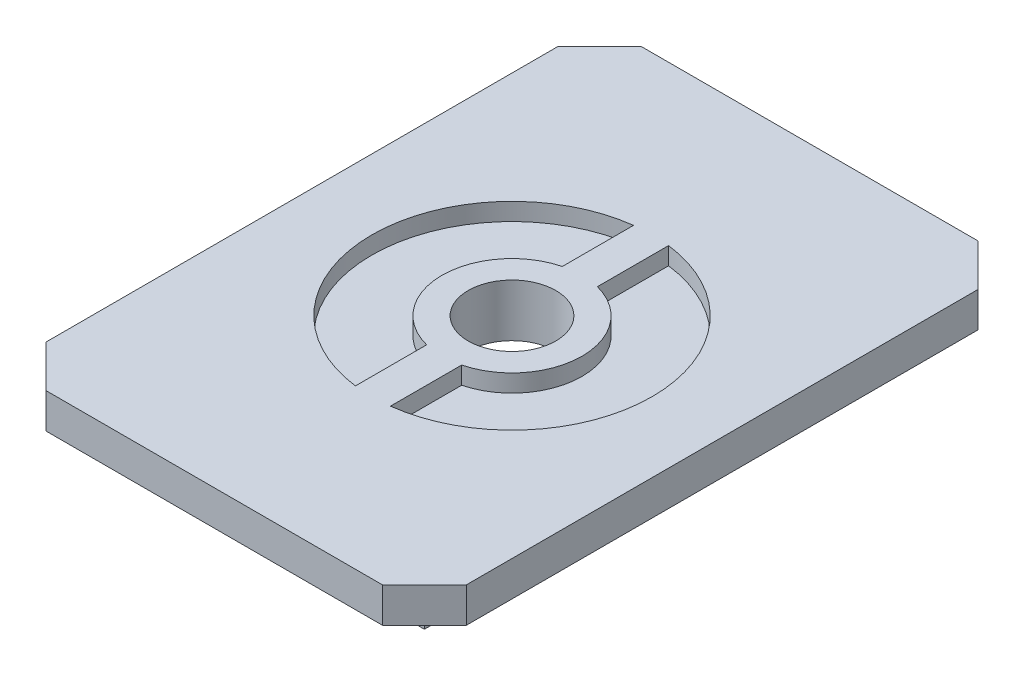
ISO-10303-21;
HEADER;
FILE_DESCRIPTION(('STEP AP214'),'2;1');
FILE_NAME('part.step','',(''),(''),'','','');
FILE_SCHEMA(('AUTOMOTIVE_DESIGN { 1 0 10303 214 1 1 1 1 }'));
ENDSEC;
DATA;
#1=APPLICATION_CONTEXT('core data for automotive mechanical design processes');
#2=APPLICATION_PROTOCOL_DEFINITION('international standard','automotive_design',2000,#1);
#3=PRODUCT_CONTEXT('',#1,'mechanical');
#4=PRODUCT('Part','Part','',(#3));
#5=PRODUCT_RELATED_PRODUCT_CATEGORY('part','',(#4));
#6=PRODUCT_DEFINITION_FORMATION('','',#4);
#7=PRODUCT_DEFINITION_CONTEXT('part definition',#1,'design');
#8=PRODUCT_DEFINITION('design','',#6,#7);
#9=PRODUCT_DEFINITION_SHAPE('','',#8);
#10=(LENGTH_UNIT() NAMED_UNIT(*) SI_UNIT(.MILLI.,.METRE.));
#11=(NAMED_UNIT(*) PLANE_ANGLE_UNIT() SI_UNIT($,.RADIAN.));
#12=(NAMED_UNIT(*) SI_UNIT($,.STERADIAN.) SOLID_ANGLE_UNIT());
#13=UNCERTAINTY_MEASURE_WITH_UNIT(LENGTH_MEASURE(1.E-05),#10,'distance_accuracy_value','');
#14=(GEOMETRIC_REPRESENTATION_CONTEXT(3) GLOBAL_UNCERTAINTY_ASSIGNED_CONTEXT((#13)) GLOBAL_UNIT_ASSIGNED_CONTEXT((#10,
#11,#12)) REPRESENTATION_CONTEXT('',''));
#15=CARTESIAN_POINT('',(0.,0.,0.));
#16=DIRECTION('',(0.,0.,1.));
#17=DIRECTION('',(1.,0.,0.));
#18=AXIS2_PLACEMENT_3D('',#15,#16,#17);
#19=CARTESIAN_POINT('',(-92.1670163689328,3.175,83.0436849533953));
#20=DIRECTION('',(0.,1.,0.));
#21=DIRECTION('',(0.,0.,1.));
#22=AXIS2_PLACEMENT_3D('',#19,#20,#21);
#23=PLANE('',#22);
#24=CARTESIAN_POINT('',(-73.1170163689327,3.175,56.0561849533953));
#25=DIRECTION('',(0.,1.,0.));
#26=DIRECTION('',(0.,0.,1.));
#27=AXIS2_PLACEMENT_3D('',#24,#25,#26);
#28=CIRCLE('',#27,3.96875000000001);
#29=CARTESIAN_POINT('',(-73.1170163689327,3.175,60.0249349533953));
#30=VERTEX_POINT('',#29);
#31=EDGE_CURVE('E225',#30,#30,#28,.T.);
#32=ORIENTED_EDGE('',*,*,#31,.F.);
#33=EDGE_LOOP('',(#32));
#34=FACE_BOUND('',#33,.T.);
#35=DIRECTION('',(0.,0.,1.));
#36=VECTOR('',#35,1.);
#37=CARTESIAN_POINT('',(-71.5295163689327,3.175,56.0561849533953));
#38=LINE('',#37,#36);
#39=CARTESIAN_POINT('',(-71.5295163689327,3.175,62.2045460154996));
#40=VERTEX_POINT('',#39);
#41=CARTESIAN_POINT('',(-71.5295163689327,3.175,68.6565755723404));
#42=VERTEX_POINT('',#41);
#43=EDGE_CURVE('E255',#40,#42,#38,.T.);
#44=ORIENTED_EDGE('',*,*,#43,.F.);
#45=CARTESIAN_POINT('',(-73.1170163689327,3.175,56.0561849533953));
#46=DIRECTION('',(0.,1.,0.));
#47=DIRECTION('',(0.,0.,1.));
#48=AXIS2_PLACEMENT_3D('',#45,#46,#47);
#49=CIRCLE('',#48,6.35);
#50=CARTESIAN_POINT('',(-71.5295163689327,3.175,49.9078238912911));
#51=VERTEX_POINT('',#50);
#52=EDGE_CURVE('E86',#40,#51,#49,.T.);
#53=ORIENTED_EDGE('',*,*,#52,.T.);
#54=DIRECTION('',(0.,0.,1.));
#55=VECTOR('',#54,1.);
#56=CARTESIAN_POINT('',(-71.5295163689327,3.175,56.0561849533953));
#57=LINE('',#56,#55);
#58=CARTESIAN_POINT('',(-71.5295163689327,3.175,43.4557943344502));
#59=VERTEX_POINT('',#58);
#60=EDGE_CURVE('E244',#59,#51,#57,.T.);
#61=ORIENTED_EDGE('',*,*,#60,.F.);
#62=CARTESIAN_POINT('',(-73.1170163689327,3.175,56.0561849533953));
#63=DIRECTION('',(0.,1.,0.));
#64=DIRECTION('',(0.,0.,1.));
#65=AXIS2_PLACEMENT_3D('',#62,#63,#64);
#66=CIRCLE('',#65,12.7);
#67=EDGE_CURVE('E258',#42,#59,#66,.T.);
#68=ORIENTED_EDGE('',*,*,#67,.F.);
#69=EDGE_LOOP('',(#44,#53,#61,#68));
#70=FACE_BOUND('',#69,.T.);
#71=DIRECTION('',(-1.,0.,0.));
#72=VECTOR('',#71,1.);
#73=CARTESIAN_POINT('',(-92.1670163689327,3.175,29.0686849533953));
#74=LINE('',#73,#72);
#75=CARTESIAN_POINT('',(-57.8770163689328,3.175,29.0686849533953));
#76=VERTEX_POINT('',#75);
#77=CARTESIAN_POINT('',(-88.3570163689327,3.175,29.0686849533953));
#78=VERTEX_POINT('',#77);
#79=EDGE_CURVE('E314',#76,#78,#74,.T.);
#80=ORIENTED_EDGE('',*,*,#79,.T.);
#81=DIRECTION('',(0.707106781186549,0.,-0.707106781186546));
#82=VECTOR('',#81,1.);
#83=CARTESIAN_POINT('',(-117.249516368933,3.175,57.9611849533952));
#84=LINE('',#83,#82);
#85=CARTESIAN_POINT('',(-92.1670163689327,3.175,32.8786849533953));
#86=VERTEX_POINT('',#85);
#87=EDGE_CURVE('E351',#78,#86,#84,.F.);
#88=ORIENTED_EDGE('',*,*,#87,.T.);
#89=DIRECTION('',(0.,0.,1.));
#90=VECTOR('',#89,1.);
#91=CARTESIAN_POINT('',(-92.1670163689327,3.175,29.0686849533953));
#92=LINE('',#91,#90);
#93=CARTESIAN_POINT('',(-92.1670163689328,3.175,79.2336849533953));
#94=VERTEX_POINT('',#93);
#95=EDGE_CURVE('E304',#86,#94,#92,.T.);
#96=ORIENTED_EDGE('',*,*,#95,.T.);
#97=DIRECTION('',(-0.707106781186546,0.,-0.707106781186549));
#98=VECTOR('',#97,1.);
#99=CARTESIAN_POINT('',(-90.2620163689328,3.175,81.1386849533953));
#100=LINE('',#99,#98);
#101=CARTESIAN_POINT('',(-88.3570163689328,3.175,83.0436849533953));
#102=VERTEX_POINT('',#101);
#103=EDGE_CURVE('E345',#94,#102,#100,.F.);
#104=ORIENTED_EDGE('',*,*,#103,.T.);
#105=DIRECTION('',(1.,0.,0.));
#106=VECTOR('',#105,1.);
#107=CARTESIAN_POINT('',(-92.1670163689328,3.175,83.0436849533953));
#108=LINE('',#107,#106);
#109=CARTESIAN_POINT('',(-57.8770163689328,3.175,83.0436849533953));
#110=VERTEX_POINT('',#109);
#111=EDGE_CURVE('E307',#102,#110,#108,.T.);
#112=ORIENTED_EDGE('',*,*,#111,.T.);
#113=DIRECTION('',(-0.707106781186549,0.,0.707106781186546));
#114=VECTOR('',#113,1.);
#115=CARTESIAN_POINT('',(-75.0220163689328,3.175,100.188684953395));
#116=LINE('',#115,#114);
#117=CARTESIAN_POINT('',(-54.0670163689328,3.175,79.2336849533953));
#118=VERTEX_POINT('',#117);
#119=EDGE_CURVE('E347',#110,#118,#116,.F.);
#120=ORIENTED_EDGE('',*,*,#119,.T.);
#121=DIRECTION('',(0.,0.,-1.));
#122=VECTOR('',#121,1.);
#123=CARTESIAN_POINT('',(-54.0670163689328,3.175,29.0686849533953));
#124=LINE('',#123,#122);
#125=CARTESIAN_POINT('',(-54.0670163689328,3.175,32.8786849533953));
#126=VERTEX_POINT('',#125);
#127=EDGE_CURVE('E311',#118,#126,#124,.T.);
#128=ORIENTED_EDGE('',*,*,#127,.T.);
#129=DIRECTION('',(0.707106781186546,0.,0.70710678118655));
#130=VECTOR('',#129,1.);
#131=CARTESIAN_POINT('',(-48.0345163689327,3.175,38.9111849533955));
#132=LINE('',#131,#130);
#133=EDGE_CURVE('E349',#126,#76,#132,.F.);
#134=ORIENTED_EDGE('',*,*,#133,.T.);
#135=EDGE_LOOP('',(#80,#88,#96,#104,#112,#120,#128,#134));
#136=FACE_BOUND('',#135,.T.);
#137=DIRECTION('',(0.,0.,1.));
#138=VECTOR('',#137,1.);
#139=CARTESIAN_POINT('',(-74.7045163689328,3.175,56.0561849533953));
#140=LINE('',#139,#138);
#141=CARTESIAN_POINT('',(-74.7045163689328,3.175,43.4557943344502));
#142=VERTEX_POINT('',#141);
#143=CARTESIAN_POINT('',(-74.7045163689328,3.175,49.9078238912911));
#144=VERTEX_POINT('',#143);
#145=EDGE_CURVE('E231',#142,#144,#140,.T.);
#146=ORIENTED_EDGE('',*,*,#145,.T.);
#147=CARTESIAN_POINT('',(-73.1170163689327,3.175,56.0561849533953));
#148=DIRECTION('',(0.,1.,0.));
#149=DIRECTION('',(0.,0.,1.));
#150=AXIS2_PLACEMENT_3D('',#147,#148,#149);
#151=CIRCLE('',#150,6.35);
#152=CARTESIAN_POINT('',(-74.7045163689328,3.175,62.2045460154996));
#153=VERTEX_POINT('',#152);
#154=EDGE_CURVE('E78',#144,#153,#151,.T.);
#155=ORIENTED_EDGE('',*,*,#154,.T.);
#156=DIRECTION('',(0.,0.,1.));
#157=VECTOR('',#156,1.);
#158=CARTESIAN_POINT('',(-74.7045163689328,3.175,56.0561849533953));
#159=LINE('',#158,#157);
#160=CARTESIAN_POINT('',(-74.7045163689328,3.175,68.6565755723404));
#161=VERTEX_POINT('',#160);
#162=EDGE_CURVE('E219',#153,#161,#159,.T.);
#163=ORIENTED_EDGE('',*,*,#162,.T.);
#164=CARTESIAN_POINT('',(-73.1170163689327,3.175,56.0561849533953));
#165=DIRECTION('',(0.,1.,0.));
#166=DIRECTION('',(0.,0.,1.));
#167=AXIS2_PLACEMENT_3D('',#164,#165,#166);
#168=CIRCLE('',#167,12.7);
#169=EDGE_CURVE('E222',#142,#161,#168,.T.);
#170=ORIENTED_EDGE('',*,*,#169,.F.);
#171=EDGE_LOOP('',(#146,#155,#163,#170));
#172=FACE_BOUND('',#171,.T.);
#173=ADVANCED_FACE('F63',(#34,#70,#136,#172),#23,.T.);
#174=CARTESIAN_POINT('',(-92.1670163689328,0.,83.0436849533953));
#175=DIRECTION('',(0.,1.,0.));
#176=DIRECTION('',(0.,0.,1.));
#177=AXIS2_PLACEMENT_3D('',#174,#175,#176);
#178=PLANE('',#177);
#179=DIRECTION('',(0.,0.,1.));
#180=VECTOR('',#179,1.);
#181=CARTESIAN_POINT('',(-92.1670163689327,0.,29.0686849533953));
#182=LINE('',#181,#180);
#183=CARTESIAN_POINT('',(-92.1670163689327,0.,32.8786849533953));
#184=VERTEX_POINT('',#183);
#185=CARTESIAN_POINT('',(-92.1670163689328,0.,79.2336849533953));
#186=VERTEX_POINT('',#185);
#187=EDGE_CURVE('E303',#184,#186,#182,.T.);
#188=ORIENTED_EDGE('',*,*,#187,.F.);
#189=DIRECTION('',(-0.707106781186549,0.,0.707106781186546));
#190=VECTOR('',#189,1.);
#191=CARTESIAN_POINT('',(-92.1670163689327,0.,32.8786849533953));
#192=LINE('',#191,#190);
#193=CARTESIAN_POINT('',(-88.3570163689327,0.,29.0686849533953));
#194=VERTEX_POINT('',#193);
#195=EDGE_CURVE('E338',#184,#194,#192,.F.);
#196=ORIENTED_EDGE('',*,*,#195,.T.);
#197=DIRECTION('',(-1.,0.,0.));
#198=VECTOR('',#197,1.);
#199=CARTESIAN_POINT('',(-92.1670163689327,0.,29.0686849533953));
#200=LINE('',#199,#198);
#201=CARTESIAN_POINT('',(-57.8770163689328,0.,29.0686849533953));
#202=VERTEX_POINT('',#201);
#203=EDGE_CURVE('E308',#202,#194,#200,.T.);
#204=ORIENTED_EDGE('',*,*,#203,.F.);
#205=DIRECTION('',(-0.707106781186546,0.,-0.70710678118655));
#206=VECTOR('',#205,1.);
#207=CARTESIAN_POINT('',(-57.8770163689328,0.,29.0686849533953));
#208=LINE('',#207,#206);
#209=CARTESIAN_POINT('',(-54.0670163689328,0.,32.8786849533954));
#210=VERTEX_POINT('',#209);
#211=EDGE_CURVE('E336',#202,#210,#208,.F.);
#212=ORIENTED_EDGE('',*,*,#211,.T.);
#213=DIRECTION('',(0.,0.,-1.));
#214=VECTOR('',#213,1.);
#215=CARTESIAN_POINT('',(-54.0670163689328,0.,29.0686849533953));
#216=LINE('',#215,#214);
#217=CARTESIAN_POINT('',(-54.0670163689328,0.,79.2336849533953));
#218=VERTEX_POINT('',#217);
#219=EDGE_CURVE('E323',#218,#210,#216,.T.);
#220=ORIENTED_EDGE('',*,*,#219,.F.);
#221=DIRECTION('',(0.707106781186549,0.,-0.707106781186546));
#222=VECTOR('',#221,1.);
#223=CARTESIAN_POINT('',(-54.0670163689328,0.,79.2336849533953));
#224=LINE('',#223,#222);
#225=CARTESIAN_POINT('',(-57.8770163689328,0.,83.0436849533953));
#226=VERTEX_POINT('',#225);
#227=EDGE_CURVE('E334',#218,#226,#224,.F.);
#228=ORIENTED_EDGE('',*,*,#227,.T.);
#229=DIRECTION('',(1.,0.,0.));
#230=VECTOR('',#229,1.);
#231=CARTESIAN_POINT('',(-92.1670163689328,0.,83.0436849533953));
#232=LINE('',#231,#230);
#233=CARTESIAN_POINT('',(-88.3570163689328,0.,83.0436849533953));
#234=VERTEX_POINT('',#233);
#235=EDGE_CURVE('E320',#234,#226,#232,.T.);
#236=ORIENTED_EDGE('',*,*,#235,.F.);
#237=DIRECTION('',(0.707106781186546,0.,0.707106781186549));
#238=VECTOR('',#237,1.);
#239=CARTESIAN_POINT('',(-88.3570163689328,0.,83.0436849533953));
#240=LINE('',#239,#238);
#241=EDGE_CURVE('E332',#234,#186,#240,.F.);
#242=ORIENTED_EDGE('',*,*,#241,.T.);
#243=EDGE_LOOP('',(#188,#196,#204,#212,#220,#228,#236,#242));
#244=FACE_BOUND('',#243,.T.);
#245=DIRECTION('',(0.,0.,-1.));
#246=VECTOR('',#245,1.);
#247=CARTESIAN_POINT('',(-88.9920163689328,0.,79.8686849533953));
#248=LINE('',#247,#246);
#249=CARTESIAN_POINT('',(-88.9920163689328,0.,79.8686849533953));
#250=VERTEX_POINT('',#249);
#251=CARTESIAN_POINT('',(-88.9920163689328,0.,32.2436849533953));
#252=VERTEX_POINT('',#251);
#253=EDGE_CURVE('E265',#250,#252,#248,.T.);
#254=ORIENTED_EDGE('',*,*,#253,.F.);
#255=DIRECTION('',(-1.,0.,0.));
#256=VECTOR('',#255,1.);
#257=CARTESIAN_POINT('',(-88.9920163689328,0.,79.8686849533953));
#258=LINE('',#257,#256);
#259=CARTESIAN_POINT('',(-57.2420163689328,0.,79.8686849533953));
#260=VERTEX_POINT('',#259);
#261=EDGE_CURVE('E275',#260,#250,#258,.T.);
#262=ORIENTED_EDGE('',*,*,#261,.F.);
#263=DIRECTION('',(0.,0.,1.));
#264=VECTOR('',#263,1.);
#265=CARTESIAN_POINT('',(-57.2420163689328,0.,79.8686849533953));
#266=LINE('',#265,#264);
#267=CARTESIAN_POINT('',(-57.2420163689327,0.,32.2436849533953));
#268=VERTEX_POINT('',#267);
#269=EDGE_CURVE('E287',#268,#260,#266,.T.);
#270=ORIENTED_EDGE('',*,*,#269,.F.);
#271=DIRECTION('',(1.,0.,0.));
#272=VECTOR('',#271,1.);
#273=CARTESIAN_POINT('',(-88.9920163689328,0.,32.2436849533953));
#274=LINE('',#273,#272);
#275=EDGE_CURVE('E284',#252,#268,#274,.T.);
#276=ORIENTED_EDGE('',*,*,#275,.F.);
#277=EDGE_LOOP('',(#254,#262,#270,#276));
#278=FACE_BOUND('',#277,.T.);
#279=ADVANCED_FACE('F368',(#244,#278),#178,.F.);
#280=CARTESIAN_POINT('',(-92.1670163689327,3.175,29.0686849533953));
#281=DIRECTION('',(1.,0.,0.));
#282=DIRECTION('',(0.,0.,-1.));
#283=AXIS2_PLACEMENT_3D('',#280,#281,#282);
#284=PLANE('',#283);
#285=ORIENTED_EDGE('',*,*,#95,.F.);
#286=DIRECTION('',(0.,-1.,0.));
#287=VECTOR('',#286,1.);
#288=CARTESIAN_POINT('',(-92.1670163689327,3.175,32.8786849533953));
#289=LINE('',#288,#287);
#290=EDGE_CURVE('E329',#86,#184,#289,.T.);
#291=ORIENTED_EDGE('',*,*,#290,.T.);
#292=ORIENTED_EDGE('',*,*,#187,.T.);
#293=DIRECTION('',(0.,1.,0.));
#294=VECTOR('',#293,1.);
#295=CARTESIAN_POINT('',(-92.1670163689328,3.175,79.2336849533953));
#296=LINE('',#295,#294);
#297=EDGE_CURVE('E317',#186,#94,#296,.T.);
#298=ORIENTED_EDGE('',*,*,#297,.T.);
#299=EDGE_LOOP('',(#285,#291,#292,#298));
#300=FACE_BOUND('',#299,.T.);
#301=ADVANCED_FACE('F396',(#300),#284,.F.);
#302=CARTESIAN_POINT('',(-92.1670163689328,3.175,83.0436849533953));
#303=DIRECTION('',(0.,0.,-1.));
#304=DIRECTION('',(-1.,0.,0.));
#305=AXIS2_PLACEMENT_3D('',#302,#303,#304);
#306=PLANE('',#305);
#307=ORIENTED_EDGE('',*,*,#235,.T.);
#308=DIRECTION('',(0.,1.,0.));
#309=VECTOR('',#308,1.);
#310=CARTESIAN_POINT('',(-57.8770163689328,3.175,83.0436849533953));
#311=LINE('',#310,#309);
#312=EDGE_CURVE('E12',#226,#110,#311,.T.);
#313=ORIENTED_EDGE('',*,*,#312,.T.);
#314=ORIENTED_EDGE('',*,*,#111,.F.);
#315=DIRECTION('',(0.,-1.,0.));
#316=VECTOR('',#315,1.);
#317=CARTESIAN_POINT('',(-88.3570163689328,3.175,83.0436849533953));
#318=LINE('',#317,#316);
#319=EDGE_CURVE('E71',#102,#234,#318,.T.);
#320=ORIENTED_EDGE('',*,*,#319,.T.);
#321=EDGE_LOOP('',(#307,#313,#314,#320));
#322=FACE_BOUND('',#321,.T.);
#323=ADVANCED_FACE('F362',(#322),#306,.F.);
#324=CARTESIAN_POINT('',(-54.0670163689328,3.175,29.0686849533953));
#325=DIRECTION('',(-1.,0.,0.));
#326=DIRECTION('',(0.,0.,1.));
#327=AXIS2_PLACEMENT_3D('',#324,#325,#326);
#328=PLANE('',#327);
#329=ORIENTED_EDGE('',*,*,#219,.T.);
#330=DIRECTION('',(0.,1.,0.));
#331=VECTOR('',#330,1.);
#332=CARTESIAN_POINT('',(-54.0670163689328,3.175,32.8786849533954));
#333=LINE('',#332,#331);
#334=EDGE_CURVE('E356',#210,#126,#333,.T.);
#335=ORIENTED_EDGE('',*,*,#334,.T.);
#336=ORIENTED_EDGE('',*,*,#127,.F.);
#337=DIRECTION('',(0.,-1.,0.));
#338=VECTOR('',#337,1.);
#339=CARTESIAN_POINT('',(-54.0670163689328,3.175,79.2336849533953));
#340=LINE('',#339,#338);
#341=EDGE_CURVE('E353',#118,#218,#340,.T.);
#342=ORIENTED_EDGE('',*,*,#341,.T.);
#343=EDGE_LOOP('',(#329,#335,#336,#342));
#344=FACE_BOUND('',#343,.T.);
#345=ADVANCED_FACE('F377',(#344),#328,.F.);
#346=CARTESIAN_POINT('',(-92.1670163689327,3.175,29.0686849533953));
#347=DIRECTION('',(0.,0.,1.));
#348=DIRECTION('',(1.,0.,0.));
#349=AXIS2_PLACEMENT_3D('',#346,#347,#348);
#350=PLANE('',#349);
#351=ORIENTED_EDGE('',*,*,#203,.T.);
#352=DIRECTION('',(0.,1.,0.));
#353=VECTOR('',#352,1.);
#354=CARTESIAN_POINT('',(-88.3570163689327,3.175,29.0686849533953));
#355=LINE('',#354,#353);
#356=EDGE_CURVE('E343',#194,#78,#355,.T.);
#357=ORIENTED_EDGE('',*,*,#356,.T.);
#358=ORIENTED_EDGE('',*,*,#79,.F.);
#359=DIRECTION('',(0.,-1.,0.));
#360=VECTOR('',#359,1.);
#361=CARTESIAN_POINT('',(-57.8770163689328,3.175,29.0686849533953));
#362=LINE('',#361,#360);
#363=EDGE_CURVE('E340',#76,#202,#362,.T.);
#364=ORIENTED_EDGE('',*,*,#363,.T.);
#365=EDGE_LOOP('',(#351,#357,#358,#364));
#366=FACE_BOUND('',#365,.T.);
#367=ADVANCED_FACE('F388',(#366),#350,.F.);
#368=CARTESIAN_POINT('',(-88.9920163689328,-1.5875,79.8686849533953));
#369=DIRECTION('',(1.,0.,0.));
#370=DIRECTION('',(0.,0.,-1.));
#371=AXIS2_PLACEMENT_3D('',#368,#369,#370);
#372=PLANE('',#371);
#373=ORIENTED_EDGE('',*,*,#253,.T.);
#374=DIRECTION('',(0.,1.,0.));
#375=VECTOR('',#374,1.);
#376=CARTESIAN_POINT('',(-88.9920163689328,-1.5875,32.2436849533953));
#377=LINE('',#376,#375);
#378=CARTESIAN_POINT('',(-88.9920163689328,-1.5875,32.2436849533953));
#379=VERTEX_POINT('',#378);
#380=EDGE_CURVE('E300',#379,#252,#377,.T.);
#381=ORIENTED_EDGE('',*,*,#380,.F.);
#382=DIRECTION('',(0.,0.,-1.));
#383=VECTOR('',#382,1.);
#384=CARTESIAN_POINT('',(-88.9920163689328,-1.5875,79.8686849533953));
#385=LINE('',#384,#383);
#386=CARTESIAN_POINT('',(-88.9920163689328,-1.5875,79.8686849533953));
#387=VERTEX_POINT('',#386);
#388=EDGE_CURVE('E271',#387,#379,#385,.T.);
#389=ORIENTED_EDGE('',*,*,#388,.F.);
#390=DIRECTION('',(0.,1.,0.));
#391=VECTOR('',#390,1.);
#392=CARTESIAN_POINT('',(-88.9920163689328,-1.5875,79.8686849533953));
#393=LINE('',#392,#391);
#394=EDGE_CURVE('E281',#387,#250,#393,.T.);
#395=ORIENTED_EDGE('',*,*,#394,.T.);
#396=EDGE_LOOP('',(#373,#381,#389,#395));
#397=FACE_BOUND('',#396,.T.);
#398=ADVANCED_FACE('F418',(#397),#372,.F.);
#399=CARTESIAN_POINT('',(-88.9920163689328,-1.5875,32.2436849533953));
#400=DIRECTION('',(0.,0.,1.));
#401=DIRECTION('',(1.,0.,0.));
#402=AXIS2_PLACEMENT_3D('',#399,#400,#401);
#403=PLANE('',#402);
#404=ORIENTED_EDGE('',*,*,#275,.T.);
#405=DIRECTION('',(0.,1.,0.));
#406=VECTOR('',#405,1.);
#407=CARTESIAN_POINT('',(-57.2420163689327,-1.5875,32.2436849533953));
#408=LINE('',#407,#406);
#409=CARTESIAN_POINT('',(-57.2420163689327,-1.5875,32.2436849533953));
#410=VERTEX_POINT('',#409);
#411=EDGE_CURVE('E297',#410,#268,#408,.T.);
#412=ORIENTED_EDGE('',*,*,#411,.F.);
#413=DIRECTION('',(1.,0.,0.));
#414=VECTOR('',#413,1.);
#415=CARTESIAN_POINT('',(-88.9920163689328,-1.5875,32.2436849533953));
#416=LINE('',#415,#414);
#417=EDGE_CURVE('E274',#379,#410,#416,.T.);
#418=ORIENTED_EDGE('',*,*,#417,.F.);
#419=ORIENTED_EDGE('',*,*,#380,.T.);
#420=EDGE_LOOP('',(#404,#412,#418,#419));
#421=FACE_BOUND('',#420,.T.);
#422=ADVANCED_FACE('F573',(#421),#403,.F.);
#423=CARTESIAN_POINT('',(-57.2420163689328,-1.5875,79.8686849533953));
#424=DIRECTION('',(-1.,0.,0.));
#425=DIRECTION('',(0.,0.,1.));
#426=AXIS2_PLACEMENT_3D('',#423,#424,#425);
#427=PLANE('',#426);
#428=ORIENTED_EDGE('',*,*,#269,.T.);
#429=DIRECTION('',(0.,1.,0.));
#430=VECTOR('',#429,1.);
#431=CARTESIAN_POINT('',(-57.2420163689328,-1.5875,79.8686849533953));
#432=LINE('',#431,#430);
#433=CARTESIAN_POINT('',(-57.2420163689328,-1.5875,79.8686849533953));
#434=VERTEX_POINT('',#433);
#435=EDGE_CURVE('E294',#434,#260,#432,.T.);
#436=ORIENTED_EDGE('',*,*,#435,.F.);
#437=DIRECTION('',(0.,0.,1.));
#438=VECTOR('',#437,1.);
#439=CARTESIAN_POINT('',(-57.2420163689328,-1.5875,79.8686849533953));
#440=LINE('',#439,#438);
#441=EDGE_CURVE('E277',#410,#434,#440,.T.);
#442=ORIENTED_EDGE('',*,*,#441,.F.);
#443=ORIENTED_EDGE('',*,*,#411,.T.);
#444=EDGE_LOOP('',(#428,#436,#442,#443));
#445=FACE_BOUND('',#444,.T.);
#446=ADVANCED_FACE('F566',(#445),#427,.F.);
#447=CARTESIAN_POINT('',(-88.9920163689328,-1.5875,79.8686849533953));
#448=DIRECTION('',(0.,0.,-1.));
#449=DIRECTION('',(-1.,0.,0.));
#450=AXIS2_PLACEMENT_3D('',#447,#448,#449);
#451=PLANE('',#450);
#452=ORIENTED_EDGE('',*,*,#261,.T.);
#453=ORIENTED_EDGE('',*,*,#394,.F.);
#454=DIRECTION('',(-1.,0.,0.));
#455=VECTOR('',#454,1.);
#456=CARTESIAN_POINT('',(-88.9920163689328,-1.5875,79.8686849533953));
#457=LINE('',#456,#455);
#458=EDGE_CURVE('E279',#434,#387,#457,.T.);
#459=ORIENTED_EDGE('',*,*,#458,.F.);
#460=ORIENTED_EDGE('',*,*,#435,.T.);
#461=EDGE_LOOP('',(#452,#453,#459,#460));
#462=FACE_BOUND('',#461,.T.);
#463=ADVANCED_FACE('F553',(#462),#451,.F.);
#464=CARTESIAN_POINT('',(-88.9920163689328,-1.5875,32.2436849533953));
#465=DIRECTION('',(0.,-1.,0.));
#466=DIRECTION('',(0.,0.,-1.));
#467=AXIS2_PLACEMENT_3D('',#464,#465,#466);
#468=PLANE('',#467);
#469=CARTESIAN_POINT('',(-73.1170163689327,-1.5875,56.0561849533953));
#470=DIRECTION('',(0.,1.,0.));
#471=DIRECTION('',(0.,0.,1.));
#472=AXIS2_PLACEMENT_3D('',#469,#470,#471);
#473=CIRCLE('',#472,3.96875000000001);
#474=CARTESIAN_POINT('',(-73.1170163689327,-1.5875,60.0249349533953));
#475=VERTEX_POINT('',#474);
#476=EDGE_CURVE('E232',#475,#475,#473,.T.);
#477=ORIENTED_EDGE('',*,*,#476,.T.);
#478=EDGE_LOOP('',(#477));
#479=FACE_BOUND('',#478,.T.);
#480=ORIENTED_EDGE('',*,*,#388,.T.);
#481=ORIENTED_EDGE('',*,*,#417,.T.);
#482=ORIENTED_EDGE('',*,*,#441,.T.);
#483=ORIENTED_EDGE('',*,*,#458,.T.);
#484=EDGE_LOOP('',(#480,#481,#482,#483));
#485=FACE_BOUND('',#484,.T.);
#486=ADVANCED_FACE('F431',(#479,#485),#468,.T.);
#487=CARTESIAN_POINT('',(-92.1670163689327,3.175,32.8786849533953));
#488=DIRECTION('',(0.707106781186546,0.,0.707106781186549));
#489=DIRECTION('',(0.707106781186549,0.,-0.707106781186546));
#490=AXIS2_PLACEMENT_3D('',#487,#488,#489);
#491=PLANE('',#490);
#492=ORIENTED_EDGE('',*,*,#87,.F.);
#493=ORIENTED_EDGE('',*,*,#356,.F.);
#494=ORIENTED_EDGE('',*,*,#195,.F.);
#495=ORIENTED_EDGE('',*,*,#290,.F.);
#496=EDGE_LOOP('',(#492,#493,#494,#495));
#497=FACE_BOUND('',#496,.T.);
#498=ADVANCED_FACE('F393',(#497),#491,.F.);
#499=CARTESIAN_POINT('',(-57.8770163689328,3.175,29.0686849533953));
#500=DIRECTION('',(-0.70710678118655,0.,0.707106781186546));
#501=DIRECTION('',(0.707106781186546,0.,0.70710678118655));
#502=AXIS2_PLACEMENT_3D('',#499,#500,#501);
#503=PLANE('',#502);
#504=ORIENTED_EDGE('',*,*,#133,.F.);
#505=ORIENTED_EDGE('',*,*,#334,.F.);
#506=ORIENTED_EDGE('',*,*,#211,.F.);
#507=ORIENTED_EDGE('',*,*,#363,.F.);
#508=EDGE_LOOP('',(#504,#505,#506,#507));
#509=FACE_BOUND('',#508,.T.);
#510=ADVANCED_FACE('F385',(#509),#503,.F.);
#511=CARTESIAN_POINT('',(-54.0670163689328,3.175,79.2336849533953));
#512=DIRECTION('',(-0.707106781186546,0.,-0.707106781186549));
#513=DIRECTION('',(-0.707106781186549,0.,0.707106781186546));
#514=AXIS2_PLACEMENT_3D('',#511,#512,#513);
#515=PLANE('',#514);
#516=ORIENTED_EDGE('',*,*,#119,.F.);
#517=ORIENTED_EDGE('',*,*,#312,.F.);
#518=ORIENTED_EDGE('',*,*,#227,.F.);
#519=ORIENTED_EDGE('',*,*,#341,.F.);
#520=EDGE_LOOP('',(#516,#517,#518,#519));
#521=FACE_BOUND('',#520,.T.);
#522=ADVANCED_FACE('F374',(#521),#515,.F.);
#523=CARTESIAN_POINT('',(-88.3570163689328,3.175,83.0436849533953));
#524=DIRECTION('',(0.707106781186549,0.,-0.707106781186546));
#525=DIRECTION('',(-0.707106781186546,0.,-0.707106781186549));
#526=AXIS2_PLACEMENT_3D('',#523,#524,#525);
#527=PLANE('',#526);
#528=ORIENTED_EDGE('',*,*,#103,.F.);
#529=ORIENTED_EDGE('',*,*,#297,.F.);
#530=ORIENTED_EDGE('',*,*,#241,.F.);
#531=ORIENTED_EDGE('',*,*,#319,.F.);
#532=EDGE_LOOP('',(#528,#529,#530,#531));
#533=FACE_BOUND('',#532,.T.);
#534=ADVANCED_FACE('F65',(#533),#527,.F.);
#535=CARTESIAN_POINT('',(-73.1170163689327,1.5875,56.0561849533953));
#536=DIRECTION('',(0.,1.,0.));
#537=DIRECTION('',(0.,0.,1.));
#538=AXIS2_PLACEMENT_3D('',#535,#536,#537);
#539=CYLINDRICAL_SURFACE('',#538,6.35);
#540=ORIENTED_EDGE('',*,*,#52,.F.);
#541=DIRECTION('',(0.,1.,0.));
#542=VECTOR('',#541,1.);
#543=CARTESIAN_POINT('',(-71.5295163689327,1.5875,62.2045460154996));
#544=LINE('',#543,#542);
#545=CARTESIAN_POINT('',(-71.5295163689327,1.5875,62.2045460154996));
#546=VERTEX_POINT('',#545);
#547=EDGE_CURVE('E253',#546,#40,#544,.T.);
#548=ORIENTED_EDGE('',*,*,#547,.F.);
#549=CARTESIAN_POINT('',(-73.1170163689327,1.5875,56.0561849533953));
#550=DIRECTION('',(0.,1.,0.));
#551=DIRECTION('',(0.,0.,1.));
#552=AXIS2_PLACEMENT_3D('',#549,#550,#551);
#553=CIRCLE('',#552,6.35);
#554=CARTESIAN_POINT('',(-71.5295163689327,1.5875,49.9078238912911));
#555=VERTEX_POINT('',#554);
#556=EDGE_CURVE('E241',#546,#555,#553,.T.);
#557=ORIENTED_EDGE('',*,*,#556,.T.);
#558=DIRECTION('',(0.,1.,0.));
#559=VECTOR('',#558,1.);
#560=CARTESIAN_POINT('',(-71.5295163689327,1.5875,49.9078238912911));
#561=LINE('',#560,#559);
#562=EDGE_CURVE('E263',#555,#51,#561,.T.);
#563=ORIENTED_EDGE('',*,*,#562,.T.);
#564=EDGE_LOOP('',(#540,#548,#557,#563));
#565=FACE_BOUND('',#564,.T.);
#566=ADVANCED_FACE('F399',(#565),#539,.T.);
#567=CARTESIAN_POINT('',(-71.5295163689327,1.5875,56.0561849533953));
#568=DIRECTION('',(-1.,0.,0.));
#569=DIRECTION('',(0.,0.,1.));
#570=AXIS2_PLACEMENT_3D('',#567,#568,#569);
#571=PLANE('',#570);
#572=ORIENTED_EDGE('',*,*,#60,.T.);
#573=ORIENTED_EDGE('',*,*,#562,.F.);
#574=DIRECTION('',(0.,0.,1.));
#575=VECTOR('',#574,1.);
#576=CARTESIAN_POINT('',(-71.5295163689327,1.5875,56.0561849533953));
#577=LINE('',#576,#575);
#578=CARTESIAN_POINT('',(-71.5295163689327,1.5875,43.4557943344502));
#579=VERTEX_POINT('',#578);
#580=EDGE_CURVE('E250',#579,#555,#577,.T.);
#581=ORIENTED_EDGE('',*,*,#580,.F.);
#582=DIRECTION('',(0.,1.,0.));
#583=VECTOR('',#582,1.);
#584=CARTESIAN_POINT('',(-71.5295163689327,1.5875,43.4557943344502));
#585=LINE('',#584,#583);
#586=EDGE_CURVE('E266',#579,#59,#585,.T.);
#587=ORIENTED_EDGE('',*,*,#586,.T.);
#588=EDGE_LOOP('',(#572,#573,#581,#587));
#589=FACE_BOUND('',#588,.T.);
#590=ADVANCED_FACE('F405',(#589),#571,.F.);
#591=CARTESIAN_POINT('',(-73.1170163689327,1.5875,56.0561849533953));
#592=DIRECTION('',(0.,1.,0.));
#593=DIRECTION('',(0.,0.,1.));
#594=AXIS2_PLACEMENT_3D('',#591,#592,#593);
#595=CYLINDRICAL_SURFACE('',#594,12.7);
#596=ORIENTED_EDGE('',*,*,#67,.T.);
#597=ORIENTED_EDGE('',*,*,#586,.F.);
#598=CARTESIAN_POINT('',(-73.1170163689327,1.5875,56.0561849533953));
#599=DIRECTION('',(0.,1.,0.));
#600=DIRECTION('',(0.,0.,1.));
#601=AXIS2_PLACEMENT_3D('',#598,#599,#600);
#602=CIRCLE('',#601,12.7);
#603=CARTESIAN_POINT('',(-71.5295163689327,1.5875,68.6565755723404));
#604=VERTEX_POINT('',#603);
#605=EDGE_CURVE('E247',#604,#579,#602,.T.);
#606=ORIENTED_EDGE('',*,*,#605,.F.);
#607=DIRECTION('',(0.,1.,0.));
#608=VECTOR('',#607,1.);
#609=CARTESIAN_POINT('',(-71.5295163689327,1.5875,68.6565755723404));
#610=LINE('',#609,#608);
#611=EDGE_CURVE('E268',#604,#42,#610,.T.);
#612=ORIENTED_EDGE('',*,*,#611,.T.);
#613=EDGE_LOOP('',(#596,#597,#606,#612));
#614=FACE_BOUND('',#613,.T.);
#615=ADVANCED_FACE('F462',(#614),#595,.F.);
#616=CARTESIAN_POINT('',(-71.5295163689327,1.5875,56.0561849533953));
#617=DIRECTION('',(-1.,0.,0.));
#618=DIRECTION('',(0.,0.,1.));
#619=AXIS2_PLACEMENT_3D('',#616,#617,#618);
#620=PLANE('',#619);
#621=ORIENTED_EDGE('',*,*,#43,.T.);
#622=ORIENTED_EDGE('',*,*,#611,.F.);
#623=DIRECTION('',(0.,0.,1.));
#624=VECTOR('',#623,1.);
#625=CARTESIAN_POINT('',(-71.5295163689327,1.5875,56.0561849533953));
#626=LINE('',#625,#624);
#627=EDGE_CURVE('E243',#546,#604,#626,.T.);
#628=ORIENTED_EDGE('',*,*,#627,.F.);
#629=ORIENTED_EDGE('',*,*,#547,.T.);
#630=EDGE_LOOP('',(#621,#622,#628,#629));
#631=FACE_BOUND('',#630,.T.);
#632=ADVANCED_FACE('F472',(#631),#620,.F.);
#633=CARTESIAN_POINT('',(-124.646869576366,1.5875,56.0561849533953));
#634=DIRECTION('',(0.,1.,0.));
#635=DIRECTION('',(0.,0.,1.));
#636=AXIS2_PLACEMENT_3D('',#633,#634,#635);
#637=PLANE('',#636);
#638=ORIENTED_EDGE('',*,*,#556,.F.);
#639=ORIENTED_EDGE('',*,*,#627,.T.);
#640=ORIENTED_EDGE('',*,*,#605,.T.);
#641=ORIENTED_EDGE('',*,*,#580,.T.);
#642=EDGE_LOOP('',(#638,#639,#640,#641));
#643=FACE_BOUND('',#642,.T.);
#644=ADVANCED_FACE('F482',(#643),#637,.T.);
#645=CARTESIAN_POINT('',(-73.1170163689327,1.5875,56.0561849533953));
#646=DIRECTION('',(0.,1.,0.));
#647=DIRECTION('',(0.,0.,1.));
#648=AXIS2_PLACEMENT_3D('',#645,#646,#647);
#649=CYLINDRICAL_SURFACE('',#648,6.35);
#650=ORIENTED_EDGE('',*,*,#154,.F.);
#651=DIRECTION('',(0.,1.,0.));
#652=VECTOR('',#651,1.);
#653=CARTESIAN_POINT('',(-74.7045163689328,1.5875,49.9078238912911));
#654=LINE('',#653,#652);
#655=CARTESIAN_POINT('',(-74.7045163689328,1.5875,49.9078238912911));
#656=VERTEX_POINT('',#655);
#657=EDGE_CURVE('E203',#656,#144,#654,.T.);
#658=ORIENTED_EDGE('',*,*,#657,.F.);
#659=CARTESIAN_POINT('',(-73.1170163689327,1.5875,56.0561849533953));
#660=DIRECTION('',(0.,1.,0.));
#661=DIRECTION('',(0.,0.,1.));
#662=AXIS2_PLACEMENT_3D('',#659,#660,#661);
#663=CIRCLE('',#662,6.35);
#664=CARTESIAN_POINT('',(-74.7045163689328,1.5875,62.2045460154996));
#665=VERTEX_POINT('',#664);
#666=EDGE_CURVE('E211',#656,#665,#663,.T.);
#667=ORIENTED_EDGE('',*,*,#666,.T.);
#668=DIRECTION('',(0.,1.,0.));
#669=VECTOR('',#668,1.);
#670=CARTESIAN_POINT('',(-74.7045163689328,1.5875,62.2045460154996));
#671=LINE('',#670,#669);
#672=EDGE_CURVE('E236',#665,#153,#671,.T.);
#673=ORIENTED_EDGE('',*,*,#672,.T.);
#674=EDGE_LOOP('',(#650,#658,#667,#673));
#675=FACE_BOUND('',#674,.T.);
#676=ADVANCED_FACE('F214',(#675),#649,.T.);
#677=CARTESIAN_POINT('',(-74.7045163689328,1.5875,56.0561849533953));
#678=DIRECTION('',(-1.,0.,0.));
#679=DIRECTION('',(0.,0.,1.));
#680=AXIS2_PLACEMENT_3D('',#677,#678,#679);
#681=PLANE('',#680);
#682=ORIENTED_EDGE('',*,*,#162,.F.);
#683=ORIENTED_EDGE('',*,*,#672,.F.);
#684=DIRECTION('',(0.,0.,1.));
#685=VECTOR('',#684,1.);
#686=CARTESIAN_POINT('',(-74.7045163689328,1.5875,56.0561849533953));
#687=LINE('',#686,#685);
#688=CARTESIAN_POINT('',(-74.7045163689328,1.5875,68.6565755723404));
#689=VERTEX_POINT('',#688);
#690=EDGE_CURVE('E216',#665,#689,#687,.T.);
#691=ORIENTED_EDGE('',*,*,#690,.T.);
#692=DIRECTION('',(0.,1.,0.));
#693=VECTOR('',#692,1.);
#694=CARTESIAN_POINT('',(-74.7045163689328,1.5875,68.6565755723404));
#695=LINE('',#694,#693);
#696=EDGE_CURVE('E238',#689,#161,#695,.T.);
#697=ORIENTED_EDGE('',*,*,#696,.T.);
#698=EDGE_LOOP('',(#682,#683,#691,#697));
#699=FACE_BOUND('',#698,.T.);
#700=ADVANCED_FACE('F503',(#699),#681,.T.);
#701=CARTESIAN_POINT('',(-73.1170163689327,1.5875,56.0561849533953));
#702=DIRECTION('',(0.,1.,0.));
#703=DIRECTION('',(0.,0.,1.));
#704=AXIS2_PLACEMENT_3D('',#701,#702,#703);
#705=CYLINDRICAL_SURFACE('',#704,12.7);
#706=ORIENTED_EDGE('',*,*,#169,.T.);
#707=ORIENTED_EDGE('',*,*,#696,.F.);
#708=CARTESIAN_POINT('',(-73.1170163689327,1.5875,56.0561849533953));
#709=DIRECTION('',(0.,1.,0.));
#710=DIRECTION('',(0.,0.,1.));
#711=AXIS2_PLACEMENT_3D('',#708,#709,#710);
#712=CIRCLE('',#711,12.7);
#713=CARTESIAN_POINT('',(-74.7045163689328,1.5875,43.4557943344502));
#714=VERTEX_POINT('',#713);
#715=EDGE_CURVE('E210',#714,#689,#712,.T.);
#716=ORIENTED_EDGE('',*,*,#715,.F.);
#717=DIRECTION('',(0.,1.,0.));
#718=VECTOR('',#717,1.);
#719=CARTESIAN_POINT('',(-74.7045163689328,1.5875,43.4557943344502));
#720=LINE('',#719,#718);
#721=EDGE_CURVE('E205',#714,#142,#720,.T.);
#722=ORIENTED_EDGE('',*,*,#721,.T.);
#723=EDGE_LOOP('',(#706,#707,#716,#722));
#724=FACE_BOUND('',#723,.T.);
#725=ADVANCED_FACE('F512',(#724),#705,.F.);
#726=CARTESIAN_POINT('',(-74.7045163689328,1.5875,56.0561849533953));
#727=DIRECTION('',(-1.,0.,0.));
#728=DIRECTION('',(0.,0.,1.));
#729=AXIS2_PLACEMENT_3D('',#726,#727,#728);
#730=PLANE('',#729);
#731=ORIENTED_EDGE('',*,*,#145,.F.);
#732=ORIENTED_EDGE('',*,*,#721,.F.);
#733=DIRECTION('',(0.,0.,1.));
#734=VECTOR('',#733,1.);
#735=CARTESIAN_POINT('',(-74.7045163689328,1.5875,56.0561849533953));
#736=LINE('',#735,#734);
#737=EDGE_CURVE('E200',#714,#656,#736,.T.);
#738=ORIENTED_EDGE('',*,*,#737,.T.);
#739=ORIENTED_EDGE('',*,*,#657,.T.);
#740=EDGE_LOOP('',(#731,#732,#738,#739));
#741=FACE_BOUND('',#740,.T.);
#742=ADVANCED_FACE('F202',(#741),#730,.T.);
#743=CARTESIAN_POINT('',(-124.646869576366,1.5875,56.0561849533953));
#744=DIRECTION('',(0.,1.,0.));
#745=DIRECTION('',(0.,0.,1.));
#746=AXIS2_PLACEMENT_3D('',#743,#744,#745);
#747=PLANE('',#746);
#748=ORIENTED_EDGE('',*,*,#666,.F.);
#749=ORIENTED_EDGE('',*,*,#737,.F.);
#750=ORIENTED_EDGE('',*,*,#715,.T.);
#751=ORIENTED_EDGE('',*,*,#690,.F.);
#752=EDGE_LOOP('',(#748,#749,#750,#751));
#753=FACE_BOUND('',#752,.T.);
#754=ADVANCED_FACE('F218',(#753),#747,.T.);
#755=CARTESIAN_POINT('',(-73.1170163689327,-1.5875,56.0561849533953));
#756=DIRECTION('',(0.,1.,0.));
#757=DIRECTION('',(0.,0.,1.));
#758=AXIS2_PLACEMENT_3D('',#755,#756,#757);
#759=CYLINDRICAL_SURFACE('',#758,3.96875000000001);
#760=ORIENTED_EDGE('',*,*,#476,.F.);
#761=EDGE_LOOP('',(#760));
#762=FACE_BOUND('',#761,.T.);
#763=ORIENTED_EDGE('',*,*,#31,.T.);
#764=EDGE_LOOP('',(#763));
#765=FACE_BOUND('',#764,.T.);
#766=ADVANCED_FACE('F538',(#762,#765),#759,.F.);
#767=CLOSED_SHELL('',(#173,#279,#301,#323,#345,#367,#398,#422,#446,#463,#486,#498,#510,#522,
#534,#566,#590,#615,#632,#644,#676,#700,#725,#742,#754,#766));
#768=MANIFOLD_SOLID_BREP('B2',#767);
#769=ADVANCED_BREP_SHAPE_REPRESENTATION('',(#18,#768),#14);
#770=SHAPE_DEFINITION_REPRESENTATION(#9,#769);
ENDSEC;
END-ISO-10303-21;
